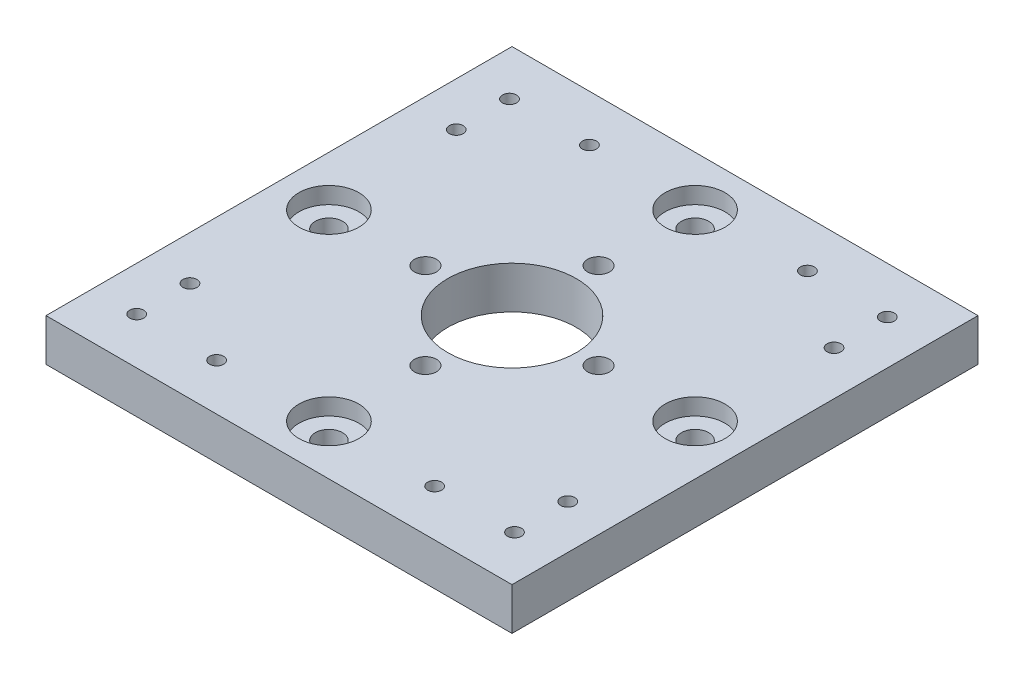
ISO-10303-21;
HEADER;
FILE_DESCRIPTION(('STEP AP214'),'2;1');
FILE_NAME('part.step','',(''),(''),'','','');
FILE_SCHEMA(('AUTOMOTIVE_DESIGN { 1 0 10303 214 1 1 1 1 }'));
ENDSEC;
DATA;
#1=APPLICATION_CONTEXT('core data for automotive mechanical design processes');
#2=APPLICATION_PROTOCOL_DEFINITION('international standard','automotive_design',2000,#1);
#3=PRODUCT_CONTEXT('',#1,'mechanical');
#4=PRODUCT('Part','Part','',(#3));
#5=PRODUCT_RELATED_PRODUCT_CATEGORY('part','',(#4));
#6=PRODUCT_DEFINITION_FORMATION('','',#4);
#7=PRODUCT_DEFINITION_CONTEXT('part definition',#1,'design');
#8=PRODUCT_DEFINITION('design','',#6,#7);
#9=PRODUCT_DEFINITION_SHAPE('','',#8);
#10=(LENGTH_UNIT() NAMED_UNIT(*) SI_UNIT(.MILLI.,.METRE.));
#11=(NAMED_UNIT(*) PLANE_ANGLE_UNIT() SI_UNIT($,.RADIAN.));
#12=(NAMED_UNIT(*) SI_UNIT($,.STERADIAN.) SOLID_ANGLE_UNIT());
#13=UNCERTAINTY_MEASURE_WITH_UNIT(LENGTH_MEASURE(1.E-05),#10,'distance_accuracy_value','');
#14=(GEOMETRIC_REPRESENTATION_CONTEXT(3) GLOBAL_UNCERTAINTY_ASSIGNED_CONTEXT((#13)) GLOBAL_UNIT_ASSIGNED_CONTEXT((#10,
#11,#12)) REPRESENTATION_CONTEXT('',''));
#15=CARTESIAN_POINT('',(0.,0.,0.));
#16=DIRECTION('',(0.,0.,1.));
#17=DIRECTION('',(1.,0.,0.));
#18=AXIS2_PLACEMENT_3D('',#15,#16,#17);
#19=CARTESIAN_POINT('',(1.55309068257925E-12,-0.00100000000000013,27.5));
#20=DIRECTION('',(0.,1.,0.));
#21=DIRECTION('',(0.,0.,1.));
#22=AXIS2_PLACEMENT_3D('',#19,#20,#21);
#23=CYLINDRICAL_SURFACE('',#22,2.05);
#24=CARTESIAN_POINT('',(1.55309068257925E-12,0.,27.5));
#25=DIRECTION('',(0.,1.,0.));
#26=DIRECTION('',(0.,0.,1.));
#27=AXIS2_PLACEMENT_3D('',#24,#25,#26);
#28=CIRCLE('',#27,2.05);
#29=CARTESIAN_POINT('',(1.55309068257925E-12,0.,29.55));
#30=VERTEX_POINT('',#29);
#31=EDGE_CURVE('E170',#30,#30,#28,.F.);
#32=ORIENTED_EDGE('',*,*,#31,.T.);
#33=EDGE_LOOP('',(#32));
#34=FACE_BOUND('',#33,.T.);
#35=CARTESIAN_POINT('',(1.55309068257925E-12,3.85,27.5));
#36=DIRECTION('',(0.,1.,0.));
#37=DIRECTION('',(0.,0.,1.));
#38=AXIS2_PLACEMENT_3D('',#35,#36,#37);
#39=CIRCLE('',#38,2.05);
#40=CARTESIAN_POINT('',(1.55309068257925E-12,3.85,29.55));
#41=VERTEX_POINT('',#40);
#42=EDGE_CURVE('E53',#41,#41,#39,.F.);
#43=ORIENTED_EDGE('',*,*,#42,.F.);
#44=EDGE_LOOP('',(#43));
#45=FACE_BOUND('',#44,.T.);
#46=ADVANCED_FACE('F49',(#34,#45),#23,.F.);
#47=CARTESIAN_POINT('',(27.5000000000008,-0.00100000000000013,-7.76545341289627E-13));
#48=DIRECTION('',(0.,1.,0.));
#49=DIRECTION('',(0.,0.,1.));
#50=AXIS2_PLACEMENT_3D('',#47,#48,#49);
#51=CYLINDRICAL_SURFACE('',#50,2.05);
#52=CARTESIAN_POINT('',(27.5000000000008,0.,-7.76545341289627E-13));
#53=DIRECTION('',(0.,1.,0.));
#54=DIRECTION('',(0.,0.,1.));
#55=AXIS2_PLACEMENT_3D('',#52,#53,#54);
#56=CIRCLE('',#55,2.05);
#57=CARTESIAN_POINT('',(27.5000000000008,0.,2.04999999999922));
#58=VERTEX_POINT('',#57);
#59=EDGE_CURVE('E175',#58,#58,#56,.F.);
#60=ORIENTED_EDGE('',*,*,#59,.T.);
#61=EDGE_LOOP('',(#60));
#62=FACE_BOUND('',#61,.T.);
#63=CARTESIAN_POINT('',(27.5000000000008,3.85,-7.76545341289627E-13));
#64=DIRECTION('',(0.,1.,0.));
#65=DIRECTION('',(0.,0.,1.));
#66=AXIS2_PLACEMENT_3D('',#63,#64,#65);
#67=CIRCLE('',#66,2.05);
#68=CARTESIAN_POINT('',(27.5000000000008,3.85,2.04999999999922));
#69=VERTEX_POINT('',#68);
#70=EDGE_CURVE('E163',#69,#69,#67,.F.);
#71=ORIENTED_EDGE('',*,*,#70,.F.);
#72=EDGE_LOOP('',(#71));
#73=FACE_BOUND('',#72,.T.);
#74=ADVANCED_FACE('F421',(#62,#73),#51,.F.);
#75=CARTESIAN_POINT('',(0.,-0.00100000000000013,-27.5));
#76=DIRECTION('',(0.,1.,0.));
#77=DIRECTION('',(0.,0.,1.));
#78=AXIS2_PLACEMENT_3D('',#75,#76,#77);
#79=CYLINDRICAL_SURFACE('',#78,2.05);
#80=CARTESIAN_POINT('',(0.,0.,-27.5));
#81=DIRECTION('',(0.,1.,0.));
#82=DIRECTION('',(0.,0.,1.));
#83=AXIS2_PLACEMENT_3D('',#80,#81,#82);
#84=CIRCLE('',#83,2.05);
#85=CARTESIAN_POINT('',(0.,0.,-25.45));
#86=VERTEX_POINT('',#85);
#87=EDGE_CURVE('E181',#86,#86,#84,.F.);
#88=ORIENTED_EDGE('',*,*,#87,.T.);
#89=EDGE_LOOP('',(#88));
#90=FACE_BOUND('',#89,.T.);
#91=CARTESIAN_POINT('',(0.,3.85,-27.5));
#92=DIRECTION('',(0.,1.,0.));
#93=DIRECTION('',(0.,0.,1.));
#94=AXIS2_PLACEMENT_3D('',#91,#92,#93);
#95=CIRCLE('',#94,2.05);
#96=CARTESIAN_POINT('',(0.,3.85,-25.45));
#97=VERTEX_POINT('',#96);
#98=EDGE_CURVE('E159',#97,#97,#95,.F.);
#99=ORIENTED_EDGE('',*,*,#98,.F.);
#100=EDGE_LOOP('',(#99));
#101=FACE_BOUND('',#100,.T.);
#102=ADVANCED_FACE('F426',(#90,#101),#79,.F.);
#103=CARTESIAN_POINT('',(-27.4999999999992,-0.00100000000000013,7.79913119987283E-13));
#104=DIRECTION('',(0.,1.,0.));
#105=DIRECTION('',(0.,0.,1.));
#106=AXIS2_PLACEMENT_3D('',#103,#104,#105);
#107=CYLINDRICAL_SURFACE('',#106,2.05);
#108=CARTESIAN_POINT('',(-27.4999999999992,0.,7.79913119987283E-13));
#109=DIRECTION('',(0.,1.,0.));
#110=DIRECTION('',(0.,0.,1.));
#111=AXIS2_PLACEMENT_3D('',#108,#109,#110);
#112=CIRCLE('',#111,2.05);
#113=CARTESIAN_POINT('',(-27.4999999999992,0.,2.05000000000078));
#114=VERTEX_POINT('',#113);
#115=EDGE_CURVE('E190',#114,#114,#112,.F.);
#116=ORIENTED_EDGE('',*,*,#115,.T.);
#117=EDGE_LOOP('',(#116));
#118=FACE_BOUND('',#117,.T.);
#119=CARTESIAN_POINT('',(-27.4999999999992,3.85,7.79913119987283E-13));
#120=DIRECTION('',(0.,1.,0.));
#121=DIRECTION('',(0.,0.,1.));
#122=AXIS2_PLACEMENT_3D('',#119,#120,#121);
#123=CIRCLE('',#122,2.05);
#124=CARTESIAN_POINT('',(-27.4999999999992,3.85,2.05000000000078));
#125=VERTEX_POINT('',#124);
#126=EDGE_CURVE('E155',#125,#125,#123,.F.);
#127=ORIENTED_EDGE('',*,*,#126,.F.);
#128=EDGE_LOOP('',(#127));
#129=FACE_BOUND('',#128,.T.);
#130=ADVANCED_FACE('F505',(#118,#129),#107,.F.);
#131=CARTESIAN_POINT('',(0.,6.35,35.));
#132=DIRECTION('',(0.,0.,-1.));
#133=DIRECTION('',(-1.,0.,0.));
#134=AXIS2_PLACEMENT_3D('',#131,#132,#133);
#135=PLANE('',#134);
#136=DIRECTION('',(1.,0.,0.));
#137=VECTOR('',#136,1.);
#138=CARTESIAN_POINT('',(0.,0.,35.));
#139=LINE('',#138,#137);
#140=CARTESIAN_POINT('',(-35.,0.,35.));
#141=VERTEX_POINT('',#140);
#142=CARTESIAN_POINT('',(35.,0.,35.));
#143=VERTEX_POINT('',#142);
#144=EDGE_CURVE('E138',#141,#143,#139,.T.);
#145=ORIENTED_EDGE('',*,*,#144,.T.);
#146=DIRECTION('',(0.,-1.,0.));
#147=VECTOR('',#146,1.);
#148=CARTESIAN_POINT('',(35.,6.35,35.));
#149=LINE('',#148,#147);
#150=CARTESIAN_POINT('',(35.,6.35,35.));
#151=VERTEX_POINT('',#150);
#152=EDGE_CURVE('E11',#151,#143,#149,.T.);
#153=ORIENTED_EDGE('',*,*,#152,.F.);
#154=DIRECTION('',(1.,0.,0.));
#155=VECTOR('',#154,1.);
#156=CARTESIAN_POINT('',(0.,6.35,35.));
#157=LINE('',#156,#155);
#158=CARTESIAN_POINT('',(-35.,6.35,35.));
#159=VERTEX_POINT('',#158);
#160=EDGE_CURVE('E102',#159,#151,#157,.T.);
#161=ORIENTED_EDGE('',*,*,#160,.F.);
#162=DIRECTION('',(0.,-1.,0.));
#163=VECTOR('',#162,1.);
#164=CARTESIAN_POINT('',(-35.,6.35,35.));
#165=LINE('',#164,#163);
#166=EDGE_CURVE('E69',#159,#141,#165,.T.);
#167=ORIENTED_EDGE('',*,*,#166,.T.);
#168=EDGE_LOOP('',(#145,#153,#161,#167));
#169=FACE_BOUND('',#168,.T.);
#170=ADVANCED_FACE('F502',(#169),#135,.F.);
#171=CARTESIAN_POINT('',(35.,6.35,0.));
#172=DIRECTION('',(-1.,0.,0.));
#173=DIRECTION('',(0.,0.,1.));
#174=AXIS2_PLACEMENT_3D('',#171,#172,#173);
#175=PLANE('',#174);
#176=DIRECTION('',(0.,0.,-1.));
#177=VECTOR('',#176,1.);
#178=CARTESIAN_POINT('',(35.,0.,0.));
#179=LINE('',#178,#177);
#180=CARTESIAN_POINT('',(35.,0.,-35.));
#181=VERTEX_POINT('',#180);
#182=EDGE_CURVE('E108',#143,#181,#179,.T.);
#183=ORIENTED_EDGE('',*,*,#182,.T.);
#184=DIRECTION('',(0.,-1.,0.));
#185=VECTOR('',#184,1.);
#186=CARTESIAN_POINT('',(35.,6.35,-35.));
#187=LINE('',#186,#185);
#188=CARTESIAN_POINT('',(35.,6.35,-35.));
#189=VERTEX_POINT('',#188);
#190=EDGE_CURVE('E60',#189,#181,#187,.T.);
#191=ORIENTED_EDGE('',*,*,#190,.F.);
#192=DIRECTION('',(0.,0.,-1.));
#193=VECTOR('',#192,1.);
#194=CARTESIAN_POINT('',(35.,6.35,0.));
#195=LINE('',#194,#193);
#196=EDGE_CURVE('E94',#151,#189,#195,.T.);
#197=ORIENTED_EDGE('',*,*,#196,.F.);
#198=ORIENTED_EDGE('',*,*,#152,.T.);
#199=EDGE_LOOP('',(#183,#191,#197,#198));
#200=FACE_BOUND('',#199,.T.);
#201=ADVANCED_FACE('F107',(#200),#175,.F.);
#202=CARTESIAN_POINT('',(0.,6.35,-35.));
#203=DIRECTION('',(0.,0.,-1.));
#204=DIRECTION('',(-1.,0.,0.));
#205=AXIS2_PLACEMENT_3D('',#202,#203,#204);
#206=PLANE('',#205);
#207=DIRECTION('',(1.,0.,0.));
#208=VECTOR('',#207,1.);
#209=CARTESIAN_POINT('',(0.,0.,-35.));
#210=LINE('',#209,#208);
#211=CARTESIAN_POINT('',(-35.,0.,-35.));
#212=VERTEX_POINT('',#211);
#213=EDGE_CURVE('E143',#212,#181,#210,.T.);
#214=ORIENTED_EDGE('',*,*,#213,.F.);
#215=DIRECTION('',(0.,-1.,0.));
#216=VECTOR('',#215,1.);
#217=CARTESIAN_POINT('',(-35.,6.35,-35.));
#218=LINE('',#217,#216);
#219=CARTESIAN_POINT('',(-35.,6.35,-35.));
#220=VERTEX_POINT('',#219);
#221=EDGE_CURVE('E83',#220,#212,#218,.T.);
#222=ORIENTED_EDGE('',*,*,#221,.F.);
#223=DIRECTION('',(1.,0.,0.));
#224=VECTOR('',#223,1.);
#225=CARTESIAN_POINT('',(0.,6.35,-35.));
#226=LINE('',#225,#224);
#227=EDGE_CURVE('E101',#220,#189,#226,.T.);
#228=ORIENTED_EDGE('',*,*,#227,.T.);
#229=ORIENTED_EDGE('',*,*,#190,.T.);
#230=EDGE_LOOP('',(#214,#222,#228,#229));
#231=FACE_BOUND('',#230,.T.);
#232=ADVANCED_FACE('F113',(#231),#206,.T.);
#233=CARTESIAN_POINT('',(0.,6.35,13.));
#234=DIRECTION('',(0.,-1.,0.));
#235=DIRECTION('',(0.,0.,-1.));
#236=AXIS2_PLACEMENT_3D('',#233,#234,#235);
#237=CYLINDRICAL_SURFACE('',#236,1.65);
#238=CARTESIAN_POINT('',(0.,6.35,13.));
#239=DIRECTION('',(0.,1.,0.));
#240=DIRECTION('',(0.,0.,1.));
#241=AXIS2_PLACEMENT_3D('',#238,#239,#240);
#242=CIRCLE('',#241,1.65);
#243=CARTESIAN_POINT('',(0.,6.35,14.65));
#244=VERTEX_POINT('',#243);
#245=EDGE_CURVE('E300',#244,#244,#242,.T.);
#246=ORIENTED_EDGE('',*,*,#245,.T.);
#247=EDGE_LOOP('',(#246));
#248=FACE_BOUND('',#247,.T.);
#249=CARTESIAN_POINT('',(0.,0.,13.));
#250=DIRECTION('',(0.,1.,0.));
#251=DIRECTION('',(0.,0.,1.));
#252=AXIS2_PLACEMENT_3D('',#249,#250,#251);
#253=CIRCLE('',#252,1.65);
#254=CARTESIAN_POINT('',(0.,0.,14.65));
#255=VERTEX_POINT('',#254);
#256=EDGE_CURVE('E134',#255,#255,#253,.T.);
#257=ORIENTED_EDGE('',*,*,#256,.F.);
#258=EDGE_LOOP('',(#257));
#259=FACE_BOUND('',#258,.T.);
#260=ADVANCED_FACE('F399',(#248,#259),#237,.F.);
#261=CARTESIAN_POINT('',(13.,6.35,0.));
#262=DIRECTION('',(0.,-1.,0.));
#263=DIRECTION('',(0.,0.,-1.));
#264=AXIS2_PLACEMENT_3D('',#261,#262,#263);
#265=CYLINDRICAL_SURFACE('',#264,1.65);
#266=CARTESIAN_POINT('',(13.,6.35,0.));
#267=DIRECTION('',(0.,1.,0.));
#268=DIRECTION('',(0.,0.,1.));
#269=AXIS2_PLACEMENT_3D('',#266,#267,#268);
#270=CIRCLE('',#269,1.65);
#271=CARTESIAN_POINT('',(13.,6.35,1.65));
#272=VERTEX_POINT('',#271);
#273=EDGE_CURVE('E296',#272,#272,#270,.T.);
#274=ORIENTED_EDGE('',*,*,#273,.T.);
#275=EDGE_LOOP('',(#274));
#276=FACE_BOUND('',#275,.T.);
#277=CARTESIAN_POINT('',(13.,0.,0.));
#278=DIRECTION('',(0.,1.,0.));
#279=DIRECTION('',(0.,0.,1.));
#280=AXIS2_PLACEMENT_3D('',#277,#278,#279);
#281=CIRCLE('',#280,1.65);
#282=CARTESIAN_POINT('',(13.,0.,1.65));
#283=VERTEX_POINT('',#282);
#284=EDGE_CURVE('E130',#283,#283,#281,.T.);
#285=ORIENTED_EDGE('',*,*,#284,.F.);
#286=EDGE_LOOP('',(#285));
#287=FACE_BOUND('',#286,.T.);
#288=ADVANCED_FACE('F402',(#276,#287),#265,.F.);
#289=CARTESIAN_POINT('',(0.,6.35,-13.));
#290=DIRECTION('',(0.,-1.,0.));
#291=DIRECTION('',(0.,0.,-1.));
#292=AXIS2_PLACEMENT_3D('',#289,#290,#291);
#293=CYLINDRICAL_SURFACE('',#292,1.65);
#294=CARTESIAN_POINT('',(0.,6.35,-13.));
#295=DIRECTION('',(0.,1.,0.));
#296=DIRECTION('',(0.,0.,1.));
#297=AXIS2_PLACEMENT_3D('',#294,#295,#296);
#298=CIRCLE('',#297,1.65);
#299=CARTESIAN_POINT('',(0.,6.35,-11.35));
#300=VERTEX_POINT('',#299);
#301=EDGE_CURVE('E292',#300,#300,#298,.T.);
#302=ORIENTED_EDGE('',*,*,#301,.T.);
#303=EDGE_LOOP('',(#302));
#304=FACE_BOUND('',#303,.T.);
#305=CARTESIAN_POINT('',(0.,0.,-13.));
#306=DIRECTION('',(0.,1.,0.));
#307=DIRECTION('',(0.,0.,1.));
#308=AXIS2_PLACEMENT_3D('',#305,#306,#307);
#309=CIRCLE('',#308,1.65);
#310=CARTESIAN_POINT('',(0.,0.,-11.35));
#311=VERTEX_POINT('',#310);
#312=EDGE_CURVE('E125',#311,#311,#309,.T.);
#313=ORIENTED_EDGE('',*,*,#312,.F.);
#314=EDGE_LOOP('',(#313));
#315=FACE_BOUND('',#314,.T.);
#316=ADVANCED_FACE('F417',(#304,#315),#293,.F.);
#317=CARTESIAN_POINT('',(-13.,6.35,0.));
#318=DIRECTION('',(0.,-1.,0.));
#319=DIRECTION('',(0.,0.,-1.));
#320=AXIS2_PLACEMENT_3D('',#317,#318,#319);
#321=CYLINDRICAL_SURFACE('',#320,1.65);
#322=CARTESIAN_POINT('',(-13.,6.35,0.));
#323=DIRECTION('',(0.,1.,0.));
#324=DIRECTION('',(0.,0.,1.));
#325=AXIS2_PLACEMENT_3D('',#322,#323,#324);
#326=CIRCLE('',#325,1.65);
#327=CARTESIAN_POINT('',(-13.,6.35,1.65));
#328=VERTEX_POINT('',#327);
#329=EDGE_CURVE('E150',#328,#328,#326,.T.);
#330=ORIENTED_EDGE('',*,*,#329,.T.);
#331=EDGE_LOOP('',(#330));
#332=FACE_BOUND('',#331,.T.);
#333=CARTESIAN_POINT('',(-13.,0.,0.));
#334=DIRECTION('',(0.,1.,0.));
#335=DIRECTION('',(0.,0.,1.));
#336=AXIS2_PLACEMENT_3D('',#333,#334,#335);
#337=CIRCLE('',#336,1.65);
#338=CARTESIAN_POINT('',(-13.,0.,1.65));
#339=VERTEX_POINT('',#338);
#340=EDGE_CURVE('E121',#339,#339,#337,.T.);
#341=ORIENTED_EDGE('',*,*,#340,.F.);
#342=EDGE_LOOP('',(#341));
#343=FACE_BOUND('',#342,.T.);
#344=ADVANCED_FACE('F51',(#332,#343),#321,.F.);
#345=CARTESIAN_POINT('',(-35.,6.35,0.));
#346=DIRECTION('',(-1.,0.,0.));
#347=DIRECTION('',(0.,0.,1.));
#348=AXIS2_PLACEMENT_3D('',#345,#346,#347);
#349=PLANE('',#348);
#350=DIRECTION('',(0.,0.,-1.));
#351=VECTOR('',#350,1.);
#352=CARTESIAN_POINT('',(-35.,0.,0.));
#353=LINE('',#352,#351);
#354=EDGE_CURVE('E146',#141,#212,#353,.T.);
#355=ORIENTED_EDGE('',*,*,#354,.F.);
#356=ORIENTED_EDGE('',*,*,#166,.F.);
#357=DIRECTION('',(0.,0.,-1.));
#358=VECTOR('',#357,1.);
#359=CARTESIAN_POINT('',(-35.,6.35,0.));
#360=LINE('',#359,#358);
#361=EDGE_CURVE('E115',#159,#220,#360,.T.);
#362=ORIENTED_EDGE('',*,*,#361,.T.);
#363=ORIENTED_EDGE('',*,*,#221,.T.);
#364=EDGE_LOOP('',(#355,#356,#362,#363));
#365=FACE_BOUND('',#364,.T.);
#366=ADVANCED_FACE('F357',(#365),#349,.T.);
#367=CARTESIAN_POINT('',(0.,6.35,0.));
#368=DIRECTION('',(0.,1.,0.));
#369=DIRECTION('',(0.,0.,1.));
#370=AXIS2_PLACEMENT_3D('',#367,#368,#369);
#371=PLANE('',#370);
#372=CARTESIAN_POINT('',(0.,6.35,-27.5));
#373=DIRECTION('',(0.,1.,0.));
#374=DIRECTION('',(0.,0.,1.));
#375=AXIS2_PLACEMENT_3D('',#372,#373,#374);
#376=CIRCLE('',#375,4.5);
#377=CARTESIAN_POINT('',(0.,6.35,-23.));
#378=VERTEX_POINT('',#377);
#379=EDGE_CURVE('E336',#378,#378,#376,.T.);
#380=ORIENTED_EDGE('',*,*,#379,.F.);
#381=EDGE_LOOP('',(#380));
#382=FACE_BOUND('',#381,.T.);
#383=CARTESIAN_POINT('',(27.5000000000008,6.35,-7.76545341289627E-13));
#384=DIRECTION('',(0.,1.,0.));
#385=DIRECTION('',(0.,0.,1.));
#386=AXIS2_PLACEMENT_3D('',#383,#384,#385);
#387=CIRCLE('',#386,4.5);
#388=CARTESIAN_POINT('',(27.5000000000008,6.35,4.49999999999923));
#389=VERTEX_POINT('',#388);
#390=EDGE_CURVE('E332',#389,#389,#387,.T.);
#391=ORIENTED_EDGE('',*,*,#390,.F.);
#392=EDGE_LOOP('',(#391));
#393=FACE_BOUND('',#392,.T.);
#394=CARTESIAN_POINT('',(1.55309068257925E-12,6.35,27.5));
#395=DIRECTION('',(0.,1.,0.));
#396=DIRECTION('',(0.,0.,1.));
#397=AXIS2_PLACEMENT_3D('',#394,#395,#396);
#398=CIRCLE('',#397,4.5);
#399=CARTESIAN_POINT('',(1.55309068257925E-12,6.35,32.));
#400=VERTEX_POINT('',#399);
#401=EDGE_CURVE('E324',#400,#400,#398,.T.);
#402=ORIENTED_EDGE('',*,*,#401,.F.);
#403=EDGE_LOOP('',(#402));
#404=FACE_BOUND('',#403,.T.);
#405=CARTESIAN_POINT('',(-27.4999999999992,6.35,7.79913119987283E-13));
#406=DIRECTION('',(0.,1.,0.));
#407=DIRECTION('',(0.,0.,1.));
#408=AXIS2_PLACEMENT_3D('',#405,#406,#407);
#409=CIRCLE('',#408,4.5);
#410=CARTESIAN_POINT('',(-27.4999999999992,6.35,4.50000000000078));
#411=VERTEX_POINT('',#410);
#412=EDGE_CURVE('E316',#411,#411,#409,.T.);
#413=ORIENTED_EDGE('',*,*,#412,.F.);
#414=EDGE_LOOP('',(#413));
#415=FACE_BOUND('',#414,.T.);
#416=CARTESIAN_POINT('',(0.,6.35,0.));
#417=DIRECTION('',(0.,1.,0.));
#418=DIRECTION('',(0.,0.,1.));
#419=AXIS2_PLACEMENT_3D('',#416,#417,#418);
#420=CIRCLE('',#419,9.65);
#421=CARTESIAN_POINT('',(0.,6.35,9.65));
#422=VERTEX_POINT('',#421);
#423=EDGE_CURVE('E185',#422,#422,#420,.T.);
#424=ORIENTED_EDGE('',*,*,#423,.F.);
#425=EDGE_LOOP('',(#424));
#426=FACE_BOUND('',#425,.T.);
#427=CARTESIAN_POINT('',(16.375,6.35,28.));
#428=DIRECTION('',(0.,1.,0.));
#429=DIRECTION('',(0.,0.,-1.));
#430=AXIS2_PLACEMENT_3D('',#427,#428,#429);
#431=CIRCLE('',#430,1.05);
#432=CARTESIAN_POINT('',(16.375,6.35,26.95));
#433=VERTEX_POINT('',#432);
#434=EDGE_CURVE('E241',#433,#433,#431,.T.);
#435=ORIENTED_EDGE('',*,*,#434,.F.);
#436=EDGE_LOOP('',(#435));
#437=FACE_BOUND('',#436,.T.);
#438=CARTESIAN_POINT('',(28.375,6.35,28.));
#439=DIRECTION('',(0.,1.,0.));
#440=DIRECTION('',(0.,0.,-1.));
#441=AXIS2_PLACEMENT_3D('',#438,#439,#440);
#442=CIRCLE('',#441,1.05);
#443=CARTESIAN_POINT('',(28.375,6.35,26.95));
#444=VERTEX_POINT('',#443);
#445=EDGE_CURVE('E233',#444,#444,#442,.T.);
#446=ORIENTED_EDGE('',*,*,#445,.F.);
#447=EDGE_LOOP('',(#446));
#448=FACE_BOUND('',#447,.T.);
#449=CARTESIAN_POINT('',(28.375,6.35,20.));
#450=DIRECTION('',(0.,1.,0.));
#451=DIRECTION('',(0.,0.,-1.));
#452=AXIS2_PLACEMENT_3D('',#449,#450,#451);
#453=CIRCLE('',#452,1.05);
#454=CARTESIAN_POINT('',(28.375,6.35,18.95));
#455=VERTEX_POINT('',#454);
#456=EDGE_CURVE('E224',#455,#455,#453,.T.);
#457=ORIENTED_EDGE('',*,*,#456,.F.);
#458=EDGE_LOOP('',(#457));
#459=FACE_BOUND('',#458,.T.);
#460=CARTESIAN_POINT('',(-16.375,6.35,-28.));
#461=DIRECTION('',(0.,1.,0.));
#462=DIRECTION('',(0.,0.,-1.));
#463=AXIS2_PLACEMENT_3D('',#460,#461,#462);
#464=CIRCLE('',#463,1.05);
#465=CARTESIAN_POINT('',(-16.375,6.35,-29.05));
#466=VERTEX_POINT('',#465);
#467=EDGE_CURVE('E223',#466,#466,#464,.T.);
#468=ORIENTED_EDGE('',*,*,#467,.F.);
#469=EDGE_LOOP('',(#468));
#470=FACE_BOUND('',#469,.T.);
#471=CARTESIAN_POINT('',(-28.375,6.35,-28.));
#472=DIRECTION('',(0.,1.,0.));
#473=DIRECTION('',(0.,0.,-1.));
#474=AXIS2_PLACEMENT_3D('',#471,#472,#473);
#475=CIRCLE('',#474,1.05);
#476=CARTESIAN_POINT('',(-28.375,6.35,-29.05));
#477=VERTEX_POINT('',#476);
#478=EDGE_CURVE('E273',#477,#477,#475,.T.);
#479=ORIENTED_EDGE('',*,*,#478,.F.);
#480=EDGE_LOOP('',(#479));
#481=FACE_BOUND('',#480,.T.);
#482=CARTESIAN_POINT('',(-28.375,6.35,-20.));
#483=DIRECTION('',(0.,1.,0.));
#484=DIRECTION('',(0.,0.,-1.));
#485=AXIS2_PLACEMENT_3D('',#482,#483,#484);
#486=CIRCLE('',#485,1.05);
#487=CARTESIAN_POINT('',(-28.375,6.35,-21.05));
#488=VERTEX_POINT('',#487);
#489=EDGE_CURVE('E265',#488,#488,#486,.T.);
#490=ORIENTED_EDGE('',*,*,#489,.F.);
#491=EDGE_LOOP('',(#490));
#492=FACE_BOUND('',#491,.T.);
#493=CARTESIAN_POINT('',(28.375,6.35,-20.));
#494=DIRECTION('',(0.,1.,0.));
#495=DIRECTION('',(0.,0.,1.));
#496=AXIS2_PLACEMENT_3D('',#493,#494,#495);
#497=CIRCLE('',#496,1.05);
#498=CARTESIAN_POINT('',(28.375,6.35,-18.95));
#499=VERTEX_POINT('',#498);
#500=EDGE_CURVE('E256',#499,#499,#497,.T.);
#501=ORIENTED_EDGE('',*,*,#500,.F.);
#502=EDGE_LOOP('',(#501));
#503=FACE_BOUND('',#502,.T.);
#504=CARTESIAN_POINT('',(28.375,6.35,-28.));
#505=DIRECTION('',(0.,1.,0.));
#506=DIRECTION('',(0.,0.,1.));
#507=AXIS2_PLACEMENT_3D('',#504,#505,#506);
#508=CIRCLE('',#507,1.05);
#509=CARTESIAN_POINT('',(28.375,6.35,-26.95));
#510=VERTEX_POINT('',#509);
#511=EDGE_CURVE('E255',#510,#510,#508,.T.);
#512=ORIENTED_EDGE('',*,*,#511,.F.);
#513=EDGE_LOOP('',(#512));
#514=FACE_BOUND('',#513,.T.);
#515=CARTESIAN_POINT('',(-28.375,6.35,28.));
#516=DIRECTION('',(0.,1.,0.));
#517=DIRECTION('',(0.,0.,1.));
#518=AXIS2_PLACEMENT_3D('',#515,#516,#517);
#519=CIRCLE('',#518,1.05);
#520=CARTESIAN_POINT('',(-28.375,6.35,29.05));
#521=VERTEX_POINT('',#520);
#522=EDGE_CURVE('E198',#521,#521,#519,.T.);
#523=ORIENTED_EDGE('',*,*,#522,.F.);
#524=EDGE_LOOP('',(#523));
#525=FACE_BOUND('',#524,.T.);
#526=CARTESIAN_POINT('',(-28.375,6.35,20.));
#527=DIRECTION('',(0.,1.,0.));
#528=DIRECTION('',(0.,0.,1.));
#529=AXIS2_PLACEMENT_3D('',#526,#527,#528);
#530=CIRCLE('',#529,1.05);
#531=CARTESIAN_POINT('',(-28.375,6.35,21.05));
#532=VERTEX_POINT('',#531);
#533=EDGE_CURVE('E208',#532,#532,#530,.T.);
#534=ORIENTED_EDGE('',*,*,#533,.F.);
#535=EDGE_LOOP('',(#534));
#536=FACE_BOUND('',#535,.T.);
#537=CARTESIAN_POINT('',(-16.375,6.35,28.));
#538=DIRECTION('',(0.,1.,0.));
#539=DIRECTION('',(0.,0.,1.));
#540=AXIS2_PLACEMENT_3D('',#537,#538,#539);
#541=CIRCLE('',#540,1.05);
#542=CARTESIAN_POINT('',(-16.375,6.35,29.05));
#543=VERTEX_POINT('',#542);
#544=EDGE_CURVE('E207',#543,#543,#541,.T.);
#545=ORIENTED_EDGE('',*,*,#544,.F.);
#546=EDGE_LOOP('',(#545));
#547=FACE_BOUND('',#546,.T.);
#548=CARTESIAN_POINT('',(16.375,6.35,-28.));
#549=DIRECTION('',(0.,1.,0.));
#550=DIRECTION('',(0.,0.,1.));
#551=AXIS2_PLACEMENT_3D('',#548,#549,#550);
#552=CIRCLE('',#551,1.05);
#553=CARTESIAN_POINT('',(16.375,6.35,-26.95));
#554=VERTEX_POINT('',#553);
#555=EDGE_CURVE('E260',#554,#554,#552,.T.);
#556=ORIENTED_EDGE('',*,*,#555,.F.);
#557=EDGE_LOOP('',(#556));
#558=FACE_BOUND('',#557,.T.);
#559=ORIENTED_EDGE('',*,*,#329,.F.);
#560=EDGE_LOOP('',(#559));
#561=FACE_BOUND('',#560,.T.);
#562=ORIENTED_EDGE('',*,*,#301,.F.);
#563=EDGE_LOOP('',(#562));
#564=FACE_BOUND('',#563,.T.);
#565=ORIENTED_EDGE('',*,*,#273,.F.);
#566=EDGE_LOOP('',(#565));
#567=FACE_BOUND('',#566,.T.);
#568=ORIENTED_EDGE('',*,*,#245,.F.);
#569=EDGE_LOOP('',(#568));
#570=FACE_BOUND('',#569,.T.);
#571=ORIENTED_EDGE('',*,*,#160,.T.);
#572=ORIENTED_EDGE('',*,*,#196,.T.);
#573=ORIENTED_EDGE('',*,*,#227,.F.);
#574=ORIENTED_EDGE('',*,*,#361,.F.);
#575=EDGE_LOOP('',(#571,#572,#573,#574));
#576=FACE_BOUND('',#575,.T.);
#577=ADVANCED_FACE('F98',(#382,#393,#404,#415,#426,#437,#448,#459,#470,#481,#492,#503,#514,#525,
#536,#547,#558,#561,#564,#567,#570,#576),#371,.T.);
#578=CARTESIAN_POINT('',(0.,0.,0.));
#579=DIRECTION('',(0.,1.,0.));
#580=DIRECTION('',(0.,0.,1.));
#581=AXIS2_PLACEMENT_3D('',#578,#579,#580);
#582=PLANE('',#581);
#583=ORIENTED_EDGE('',*,*,#115,.F.);
#584=EDGE_LOOP('',(#583));
#585=FACE_BOUND('',#584,.T.);
#586=ORIENTED_EDGE('',*,*,#87,.F.);
#587=EDGE_LOOP('',(#586));
#588=FACE_BOUND('',#587,.T.);
#589=ORIENTED_EDGE('',*,*,#59,.F.);
#590=EDGE_LOOP('',(#589));
#591=FACE_BOUND('',#590,.T.);
#592=ORIENTED_EDGE('',*,*,#31,.F.);
#593=EDGE_LOOP('',(#592));
#594=FACE_BOUND('',#593,.T.);
#595=CARTESIAN_POINT('',(0.,0.,0.));
#596=DIRECTION('',(0.,1.,0.));
#597=DIRECTION('',(0.,0.,1.));
#598=AXIS2_PLACEMENT_3D('',#595,#596,#597);
#599=CIRCLE('',#598,9.65);
#600=CARTESIAN_POINT('',(0.,0.,9.65));
#601=VERTEX_POINT('',#600);
#602=EDGE_CURVE('E189',#601,#601,#599,.F.);
#603=ORIENTED_EDGE('',*,*,#602,.F.);
#604=EDGE_LOOP('',(#603));
#605=FACE_BOUND('',#604,.T.);
#606=CARTESIAN_POINT('',(16.375,0.,28.));
#607=DIRECTION('',(0.,1.,0.));
#608=DIRECTION('',(0.,0.,1.));
#609=AXIS2_PLACEMENT_3D('',#606,#607,#608);
#610=CIRCLE('',#609,1.05);
#611=CARTESIAN_POINT('',(16.375,0.,29.05));
#612=VERTEX_POINT('',#611);
#613=EDGE_CURVE('E212',#612,#612,#610,.F.);
#614=ORIENTED_EDGE('',*,*,#613,.F.);
#615=EDGE_LOOP('',(#614));
#616=FACE_BOUND('',#615,.T.);
#617=CARTESIAN_POINT('',(28.375,0.,28.));
#618=DIRECTION('',(0.,1.,0.));
#619=DIRECTION('',(0.,0.,1.));
#620=AXIS2_PLACEMENT_3D('',#617,#618,#619);
#621=CIRCLE('',#620,1.05);
#622=CARTESIAN_POINT('',(28.375,0.,29.05));
#623=VERTEX_POINT('',#622);
#624=EDGE_CURVE('E237',#623,#623,#621,.F.);
#625=ORIENTED_EDGE('',*,*,#624,.F.);
#626=EDGE_LOOP('',(#625));
#627=FACE_BOUND('',#626,.T.);
#628=CARTESIAN_POINT('',(28.375,0.,20.));
#629=DIRECTION('',(0.,1.,0.));
#630=DIRECTION('',(0.,0.,1.));
#631=AXIS2_PLACEMENT_3D('',#628,#629,#630);
#632=CIRCLE('',#631,1.05);
#633=CARTESIAN_POINT('',(28.375,0.,21.05));
#634=VERTEX_POINT('',#633);
#635=EDGE_CURVE('E229',#634,#634,#632,.F.);
#636=ORIENTED_EDGE('',*,*,#635,.F.);
#637=EDGE_LOOP('',(#636));
#638=FACE_BOUND('',#637,.T.);
#639=CARTESIAN_POINT('',(-16.375,0.,-28.));
#640=DIRECTION('',(0.,1.,0.));
#641=DIRECTION('',(0.,0.,1.));
#642=AXIS2_PLACEMENT_3D('',#639,#640,#641);
#643=CIRCLE('',#642,1.05);
#644=CARTESIAN_POINT('',(-16.375,0.,-26.95));
#645=VERTEX_POINT('',#644);
#646=EDGE_CURVE('E219',#645,#645,#643,.F.);
#647=ORIENTED_EDGE('',*,*,#646,.F.);
#648=EDGE_LOOP('',(#647));
#649=FACE_BOUND('',#648,.T.);
#650=CARTESIAN_POINT('',(-28.375,0.,-28.));
#651=DIRECTION('',(0.,1.,0.));
#652=DIRECTION('',(0.,0.,1.));
#653=AXIS2_PLACEMENT_3D('',#650,#651,#652);
#654=CIRCLE('',#653,1.05);
#655=CARTESIAN_POINT('',(-28.375,0.,-26.95));
#656=VERTEX_POINT('',#655);
#657=EDGE_CURVE('E228',#656,#656,#654,.F.);
#658=ORIENTED_EDGE('',*,*,#657,.F.);
#659=EDGE_LOOP('',(#658));
#660=FACE_BOUND('',#659,.T.);
#661=CARTESIAN_POINT('',(-28.375,0.,-20.));
#662=DIRECTION('',(0.,1.,0.));
#663=DIRECTION('',(0.,0.,1.));
#664=AXIS2_PLACEMENT_3D('',#661,#662,#663);
#665=CIRCLE('',#664,1.05);
#666=CARTESIAN_POINT('',(-28.375,0.,-18.95));
#667=VERTEX_POINT('',#666);
#668=EDGE_CURVE('E269',#667,#667,#665,.F.);
#669=ORIENTED_EDGE('',*,*,#668,.F.);
#670=EDGE_LOOP('',(#669));
#671=FACE_BOUND('',#670,.T.);
#672=CARTESIAN_POINT('',(28.375,0.,-20.));
#673=DIRECTION('',(0.,1.,0.));
#674=DIRECTION('',(0.,0.,1.));
#675=AXIS2_PLACEMENT_3D('',#672,#673,#674);
#676=CIRCLE('',#675,1.05);
#677=CARTESIAN_POINT('',(28.375,0.,-18.95));
#678=VERTEX_POINT('',#677);
#679=EDGE_CURVE('E261',#678,#678,#676,.F.);
#680=ORIENTED_EDGE('',*,*,#679,.F.);
#681=EDGE_LOOP('',(#680));
#682=FACE_BOUND('',#681,.T.);
#683=CARTESIAN_POINT('',(28.375,0.,-28.));
#684=DIRECTION('',(0.,1.,0.));
#685=DIRECTION('',(0.,0.,1.));
#686=AXIS2_PLACEMENT_3D('',#683,#684,#685);
#687=CIRCLE('',#686,1.05);
#688=CARTESIAN_POINT('',(28.375,0.,-26.95));
#689=VERTEX_POINT('',#688);
#690=EDGE_CURVE('E251',#689,#689,#687,.F.);
#691=ORIENTED_EDGE('',*,*,#690,.F.);
#692=EDGE_LOOP('',(#691));
#693=FACE_BOUND('',#692,.T.);
#694=CARTESIAN_POINT('',(-28.375,0.,28.));
#695=DIRECTION('',(0.,1.,0.));
#696=DIRECTION('',(0.,0.,1.));
#697=AXIS2_PLACEMENT_3D('',#694,#695,#696);
#698=CIRCLE('',#697,1.05);
#699=CARTESIAN_POINT('',(-28.375,0.,29.05));
#700=VERTEX_POINT('',#699);
#701=EDGE_CURVE('E194',#700,#700,#698,.F.);
#702=ORIENTED_EDGE('',*,*,#701,.F.);
#703=EDGE_LOOP('',(#702));
#704=FACE_BOUND('',#703,.T.);
#705=CARTESIAN_POINT('',(-28.375,0.,20.));
#706=DIRECTION('',(0.,1.,0.));
#707=DIRECTION('',(0.,0.,1.));
#708=AXIS2_PLACEMENT_3D('',#705,#706,#707);
#709=CIRCLE('',#708,1.05);
#710=CARTESIAN_POINT('',(-28.375,0.,21.05));
#711=VERTEX_POINT('',#710);
#712=EDGE_CURVE('E202',#711,#711,#709,.F.);
#713=ORIENTED_EDGE('',*,*,#712,.F.);
#714=EDGE_LOOP('',(#713));
#715=FACE_BOUND('',#714,.T.);
#716=CARTESIAN_POINT('',(-16.375,0.,28.));
#717=DIRECTION('',(0.,1.,0.));
#718=DIRECTION('',(0.,0.,1.));
#719=AXIS2_PLACEMENT_3D('',#716,#717,#718);
#720=CIRCLE('',#719,1.05);
#721=CARTESIAN_POINT('',(-16.375,0.,29.05));
#722=VERTEX_POINT('',#721);
#723=EDGE_CURVE('E203',#722,#722,#720,.F.);
#724=ORIENTED_EDGE('',*,*,#723,.F.);
#725=EDGE_LOOP('',(#724));
#726=FACE_BOUND('',#725,.T.);
#727=CARTESIAN_POINT('',(16.375,0.,-28.));
#728=DIRECTION('',(0.,1.,0.));
#729=DIRECTION('',(0.,0.,1.));
#730=AXIS2_PLACEMENT_3D('',#727,#728,#729);
#731=CIRCLE('',#730,1.05);
#732=CARTESIAN_POINT('',(16.375,0.,-26.95));
#733=VERTEX_POINT('',#732);
#734=EDGE_CURVE('E126',#733,#733,#731,.F.);
#735=ORIENTED_EDGE('',*,*,#734,.F.);
#736=EDGE_LOOP('',(#735));
#737=FACE_BOUND('',#736,.T.);
#738=ORIENTED_EDGE('',*,*,#340,.T.);
#739=EDGE_LOOP('',(#738));
#740=FACE_BOUND('',#739,.T.);
#741=ORIENTED_EDGE('',*,*,#312,.T.);
#742=EDGE_LOOP('',(#741));
#743=FACE_BOUND('',#742,.T.);
#744=ORIENTED_EDGE('',*,*,#284,.T.);
#745=EDGE_LOOP('',(#744));
#746=FACE_BOUND('',#745,.T.);
#747=ORIENTED_EDGE('',*,*,#256,.T.);
#748=EDGE_LOOP('',(#747));
#749=FACE_BOUND('',#748,.T.);
#750=ORIENTED_EDGE('',*,*,#144,.F.);
#751=ORIENTED_EDGE('',*,*,#354,.T.);
#752=ORIENTED_EDGE('',*,*,#213,.T.);
#753=ORIENTED_EDGE('',*,*,#182,.F.);
#754=EDGE_LOOP('',(#750,#751,#752,#753));
#755=FACE_BOUND('',#754,.T.);
#756=ADVANCED_FACE('F356',(#585,#588,#591,#594,#605,#616,#627,#638,#649,#660,#671,#682,#693,
#704,#715,#726,#737,#740,#743,#746,#749,#755),#582,.F.);
#757=CARTESIAN_POINT('',(16.375,-0.00100000000000013,-28.));
#758=DIRECTION('',(0.,1.,0.));
#759=DIRECTION('',(0.,0.,1.));
#760=AXIS2_PLACEMENT_3D('',#757,#758,#759);
#761=CYLINDRICAL_SURFACE('',#760,1.05);
#762=ORIENTED_EDGE('',*,*,#555,.T.);
#763=EDGE_LOOP('',(#762));
#764=FACE_BOUND('',#763,.T.);
#765=ORIENTED_EDGE('',*,*,#734,.T.);
#766=EDGE_LOOP('',(#765));
#767=FACE_BOUND('',#766,.T.);
#768=ADVANCED_FACE('F408',(#764,#767),#761,.F.);
#769=CARTESIAN_POINT('',(-16.375,-0.00100000000000013,28.));
#770=DIRECTION('',(0.,1.,0.));
#771=DIRECTION('',(0.,0.,1.));
#772=AXIS2_PLACEMENT_3D('',#769,#770,#771);
#773=CYLINDRICAL_SURFACE('',#772,1.05);
#774=ORIENTED_EDGE('',*,*,#544,.T.);
#775=EDGE_LOOP('',(#774));
#776=FACE_BOUND('',#775,.T.);
#777=ORIENTED_EDGE('',*,*,#723,.T.);
#778=EDGE_LOOP('',(#777));
#779=FACE_BOUND('',#778,.T.);
#780=ADVANCED_FACE('F444',(#776,#779),#773,.F.);
#781=CARTESIAN_POINT('',(-28.375,-0.00100000000000013,20.));
#782=DIRECTION('',(0.,1.,0.));
#783=DIRECTION('',(0.,0.,1.));
#784=AXIS2_PLACEMENT_3D('',#781,#782,#783);
#785=CYLINDRICAL_SURFACE('',#784,1.05);
#786=ORIENTED_EDGE('',*,*,#533,.T.);
#787=EDGE_LOOP('',(#786));
#788=FACE_BOUND('',#787,.T.);
#789=ORIENTED_EDGE('',*,*,#712,.T.);
#790=EDGE_LOOP('',(#789));
#791=FACE_BOUND('',#790,.T.);
#792=ADVANCED_FACE('F442',(#788,#791),#785,.F.);
#793=CARTESIAN_POINT('',(-28.375,-0.00100000000000013,28.));
#794=DIRECTION('',(0.,1.,0.));
#795=DIRECTION('',(0.,0.,1.));
#796=AXIS2_PLACEMENT_3D('',#793,#794,#795);
#797=CYLINDRICAL_SURFACE('',#796,1.05);
#798=ORIENTED_EDGE('',*,*,#522,.T.);
#799=EDGE_LOOP('',(#798));
#800=FACE_BOUND('',#799,.T.);
#801=ORIENTED_EDGE('',*,*,#701,.T.);
#802=EDGE_LOOP('',(#801));
#803=FACE_BOUND('',#802,.T.);
#804=ADVANCED_FACE('F438',(#800,#803),#797,.F.);
#805=CARTESIAN_POINT('',(28.375,-0.00100000000000013,-28.));
#806=DIRECTION('',(0.,1.,0.));
#807=DIRECTION('',(0.,0.,1.));
#808=AXIS2_PLACEMENT_3D('',#805,#806,#807);
#809=CYLINDRICAL_SURFACE('',#808,1.05);
#810=ORIENTED_EDGE('',*,*,#511,.T.);
#811=EDGE_LOOP('',(#810));
#812=FACE_BOUND('',#811,.T.);
#813=ORIENTED_EDGE('',*,*,#690,.T.);
#814=EDGE_LOOP('',(#813));
#815=FACE_BOUND('',#814,.T.);
#816=ADVANCED_FACE('F441',(#812,#815),#809,.F.);
#817=CARTESIAN_POINT('',(28.375,-0.00100000000000013,-20.));
#818=DIRECTION('',(0.,1.,0.));
#819=DIRECTION('',(0.,0.,1.));
#820=AXIS2_PLACEMENT_3D('',#817,#818,#819);
#821=CYLINDRICAL_SURFACE('',#820,1.05);
#822=ORIENTED_EDGE('',*,*,#500,.T.);
#823=EDGE_LOOP('',(#822));
#824=FACE_BOUND('',#823,.T.);
#825=ORIENTED_EDGE('',*,*,#679,.T.);
#826=EDGE_LOOP('',(#825));
#827=FACE_BOUND('',#826,.T.);
#828=ADVANCED_FACE('F469',(#824,#827),#821,.F.);
#829=CARTESIAN_POINT('',(-28.375,-0.00100000000000013,-20.));
#830=DIRECTION('',(0.,1.,0.));
#831=DIRECTION('',(0.,0.,1.));
#832=AXIS2_PLACEMENT_3D('',#829,#830,#831);
#833=CYLINDRICAL_SURFACE('',#832,1.05);
#834=ORIENTED_EDGE('',*,*,#489,.T.);
#835=EDGE_LOOP('',(#834));
#836=FACE_BOUND('',#835,.T.);
#837=ORIENTED_EDGE('',*,*,#668,.T.);
#838=EDGE_LOOP('',(#837));
#839=FACE_BOUND('',#838,.T.);
#840=ADVANCED_FACE('F473',(#836,#839),#833,.F.);
#841=CARTESIAN_POINT('',(-28.375,-0.00100000000000013,-28.));
#842=DIRECTION('',(0.,1.,0.));
#843=DIRECTION('',(0.,0.,1.));
#844=AXIS2_PLACEMENT_3D('',#841,#842,#843);
#845=CYLINDRICAL_SURFACE('',#844,1.05);
#846=ORIENTED_EDGE('',*,*,#478,.T.);
#847=EDGE_LOOP('',(#846));
#848=FACE_BOUND('',#847,.T.);
#849=ORIENTED_EDGE('',*,*,#657,.T.);
#850=EDGE_LOOP('',(#849));
#851=FACE_BOUND('',#850,.T.);
#852=ADVANCED_FACE('F455',(#848,#851),#845,.F.);
#853=CARTESIAN_POINT('',(-16.375,-0.00100000000000013,-28.));
#854=DIRECTION('',(0.,1.,0.));
#855=DIRECTION('',(0.,0.,1.));
#856=AXIS2_PLACEMENT_3D('',#853,#854,#855);
#857=CYLINDRICAL_SURFACE('',#856,1.05);
#858=ORIENTED_EDGE('',*,*,#467,.T.);
#859=EDGE_LOOP('',(#858));
#860=FACE_BOUND('',#859,.T.);
#861=ORIENTED_EDGE('',*,*,#646,.T.);
#862=EDGE_LOOP('',(#861));
#863=FACE_BOUND('',#862,.T.);
#864=ADVANCED_FACE('F451',(#860,#863),#857,.F.);
#865=CARTESIAN_POINT('',(28.375,-0.00100000000000013,20.));
#866=DIRECTION('',(0.,1.,0.));
#867=DIRECTION('',(0.,0.,1.));
#868=AXIS2_PLACEMENT_3D('',#865,#866,#867);
#869=CYLINDRICAL_SURFACE('',#868,1.05);
#870=ORIENTED_EDGE('',*,*,#456,.T.);
#871=EDGE_LOOP('',(#870));
#872=FACE_BOUND('',#871,.T.);
#873=ORIENTED_EDGE('',*,*,#635,.T.);
#874=EDGE_LOOP('',(#873));
#875=FACE_BOUND('',#874,.T.);
#876=ADVANCED_FACE('F454',(#872,#875),#869,.F.);
#877=CARTESIAN_POINT('',(28.375,-0.00100000000000013,28.));
#878=DIRECTION('',(0.,1.,0.));
#879=DIRECTION('',(0.,0.,1.));
#880=AXIS2_PLACEMENT_3D('',#877,#878,#879);
#881=CYLINDRICAL_SURFACE('',#880,1.05);
#882=ORIENTED_EDGE('',*,*,#445,.T.);
#883=EDGE_LOOP('',(#882));
#884=FACE_BOUND('',#883,.T.);
#885=ORIENTED_EDGE('',*,*,#624,.T.);
#886=EDGE_LOOP('',(#885));
#887=FACE_BOUND('',#886,.T.);
#888=ADVANCED_FACE('F459',(#884,#887),#881,.F.);
#889=CARTESIAN_POINT('',(16.375,-0.00100000000000013,28.));
#890=DIRECTION('',(0.,1.,0.));
#891=DIRECTION('',(0.,0.,1.));
#892=AXIS2_PLACEMENT_3D('',#889,#890,#891);
#893=CYLINDRICAL_SURFACE('',#892,1.05);
#894=ORIENTED_EDGE('',*,*,#434,.T.);
#895=EDGE_LOOP('',(#894));
#896=FACE_BOUND('',#895,.T.);
#897=ORIENTED_EDGE('',*,*,#613,.T.);
#898=EDGE_LOOP('',(#897));
#899=FACE_BOUND('',#898,.T.);
#900=ADVANCED_FACE('F436',(#896,#899),#893,.F.);
#901=CARTESIAN_POINT('',(0.,-0.00100000000000013,0.));
#902=DIRECTION('',(0.,1.,0.));
#903=DIRECTION('',(0.,0.,1.));
#904=AXIS2_PLACEMENT_3D('',#901,#902,#903);
#905=CYLINDRICAL_SURFACE('',#904,9.65);
#906=ORIENTED_EDGE('',*,*,#423,.T.);
#907=EDGE_LOOP('',(#906));
#908=FACE_BOUND('',#907,.T.);
#909=ORIENTED_EDGE('',*,*,#602,.T.);
#910=EDGE_LOOP('',(#909));
#911=FACE_BOUND('',#910,.T.);
#912=ADVANCED_FACE('F432',(#908,#911),#905,.F.);
#913=CARTESIAN_POINT('',(-27.4999999999992,3.85,7.79913119987283E-13));
#914=DIRECTION('',(0.,1.,0.));
#915=DIRECTION('',(0.,0.,1.));
#916=AXIS2_PLACEMENT_3D('',#913,#914,#915);
#917=PLANE('',#916);
#918=CARTESIAN_POINT('',(-27.4999999999992,3.85,7.79913119987283E-13));
#919=DIRECTION('',(0.,1.,0.));
#920=DIRECTION('',(0.,0.,1.));
#921=AXIS2_PLACEMENT_3D('',#918,#919,#920);
#922=CIRCLE('',#921,4.5);
#923=CARTESIAN_POINT('',(-27.4999999999992,3.85,4.50000000000078));
#924=VERTEX_POINT('',#923);
#925=EDGE_CURVE('E312',#924,#924,#922,.T.);
#926=ORIENTED_EDGE('',*,*,#925,.T.);
#927=EDGE_LOOP('',(#926));
#928=FACE_BOUND('',#927,.T.);
#929=ORIENTED_EDGE('',*,*,#126,.T.);
#930=EDGE_LOOP('',(#929));
#931=FACE_BOUND('',#930,.T.);
#932=ADVANCED_FACE('F435',(#928,#931),#917,.T.);
#933=CARTESIAN_POINT('',(-27.4999999999992,3.85,7.79913119987283E-13));
#934=DIRECTION('',(0.,1.,0.));
#935=DIRECTION('',(0.,0.,1.));
#936=AXIS2_PLACEMENT_3D('',#933,#934,#935);
#937=CYLINDRICAL_SURFACE('',#936,4.5);
#938=ORIENTED_EDGE('',*,*,#925,.F.);
#939=EDGE_LOOP('',(#938));
#940=FACE_BOUND('',#939,.T.);
#941=ORIENTED_EDGE('',*,*,#412,.T.);
#942=EDGE_LOOP('',(#941));
#943=FACE_BOUND('',#942,.T.);
#944=ADVANCED_FACE('F664',(#940,#943),#937,.F.);
#945=CARTESIAN_POINT('',(0.,3.85,-27.5));
#946=DIRECTION('',(0.,1.,0.));
#947=DIRECTION('',(0.,0.,1.));
#948=AXIS2_PLACEMENT_3D('',#945,#946,#947);
#949=PLANE('',#948);
#950=CARTESIAN_POINT('',(0.,3.85,-27.5));
#951=DIRECTION('',(0.,1.,0.));
#952=DIRECTION('',(0.,0.,1.));
#953=AXIS2_PLACEMENT_3D('',#950,#951,#952);
#954=CIRCLE('',#953,4.5);
#955=CARTESIAN_POINT('',(0.,3.85,-23.));
#956=VERTEX_POINT('',#955);
#957=EDGE_CURVE('E160',#956,#956,#954,.T.);
#958=ORIENTED_EDGE('',*,*,#957,.T.);
#959=EDGE_LOOP('',(#958));
#960=FACE_BOUND('',#959,.T.);
#961=ORIENTED_EDGE('',*,*,#98,.T.);
#962=EDGE_LOOP('',(#961));
#963=FACE_BOUND('',#962,.T.);
#964=ADVANCED_FACE('F344',(#960,#963),#949,.T.);
#965=CARTESIAN_POINT('',(0.,3.85,-27.5));
#966=DIRECTION('',(0.,1.,0.));
#967=DIRECTION('',(0.,0.,1.));
#968=AXIS2_PLACEMENT_3D('',#965,#966,#967);
#969=CYLINDRICAL_SURFACE('',#968,4.5);
#970=ORIENTED_EDGE('',*,*,#957,.F.);
#971=EDGE_LOOP('',(#970));
#972=FACE_BOUND('',#971,.T.);
#973=ORIENTED_EDGE('',*,*,#379,.T.);
#974=EDGE_LOOP('',(#973));
#975=FACE_BOUND('',#974,.T.);
#976=ADVANCED_FACE('F347',(#972,#975),#969,.F.);
#977=CARTESIAN_POINT('',(27.5000000000008,3.85,-7.76545341289627E-13));
#978=DIRECTION('',(0.,1.,0.));
#979=DIRECTION('',(0.,0.,1.));
#980=AXIS2_PLACEMENT_3D('',#977,#978,#979);
#981=PLANE('',#980);
#982=CARTESIAN_POINT('',(27.5000000000008,3.85,-7.76545341289627E-13));
#983=DIRECTION('',(0.,1.,0.));
#984=DIRECTION('',(0.,0.,1.));
#985=AXIS2_PLACEMENT_3D('',#982,#983,#984);
#986=CIRCLE('',#985,4.5);
#987=CARTESIAN_POINT('',(27.5000000000008,3.85,4.49999999999923));
#988=VERTEX_POINT('',#987);
#989=EDGE_CURVE('E328',#988,#988,#986,.T.);
#990=ORIENTED_EDGE('',*,*,#989,.T.);
#991=EDGE_LOOP('',(#990));
#992=FACE_BOUND('',#991,.T.);
#993=ORIENTED_EDGE('',*,*,#70,.T.);
#994=EDGE_LOOP('',(#993));
#995=FACE_BOUND('',#994,.T.);
#996=ADVANCED_FACE('F350',(#992,#995),#981,.T.);
#997=CARTESIAN_POINT('',(27.5000000000008,3.85,-7.76545341289627E-13));
#998=DIRECTION('',(0.,1.,0.));
#999=DIRECTION('',(0.,0.,1.));
#1000=AXIS2_PLACEMENT_3D('',#997,#998,#999);
#1001=CYLINDRICAL_SURFACE('',#1000,4.5);
#1002=ORIENTED_EDGE('',*,*,#989,.F.);
#1003=EDGE_LOOP('',(#1002));
#1004=FACE_BOUND('',#1003,.T.);
#1005=ORIENTED_EDGE('',*,*,#390,.T.);
#1006=EDGE_LOOP('',(#1005));
#1007=FACE_BOUND('',#1006,.T.);
#1008=ADVANCED_FACE('F697',(#1004,#1007),#1001,.F.);
#1009=CARTESIAN_POINT('',(1.55309068257925E-12,3.85,27.5));
#1010=DIRECTION('',(0.,1.,0.));
#1011=DIRECTION('',(0.,0.,1.));
#1012=AXIS2_PLACEMENT_3D('',#1009,#1010,#1011);
#1013=PLANE('',#1012);
#1014=CARTESIAN_POINT('',(1.55309068257925E-12,3.85,27.5));
#1015=DIRECTION('',(0.,1.,0.));
#1016=DIRECTION('',(0.,0.,1.));
#1017=AXIS2_PLACEMENT_3D('',#1014,#1015,#1016);
#1018=CIRCLE('',#1017,4.5);
#1019=CARTESIAN_POINT('',(1.55309068257925E-12,3.85,32.));
#1020=VERTEX_POINT('',#1019);
#1021=EDGE_CURVE('E320',#1020,#1020,#1018,.T.);
#1022=ORIENTED_EDGE('',*,*,#1021,.T.);
#1023=EDGE_LOOP('',(#1022));
#1024=FACE_BOUND('',#1023,.T.);
#1025=ORIENTED_EDGE('',*,*,#42,.T.);
#1026=EDGE_LOOP('',(#1025));
#1027=FACE_BOUND('',#1026,.T.);
#1028=ADVANCED_FACE('F707',(#1024,#1027),#1013,.T.);
#1029=CARTESIAN_POINT('',(1.55309068257925E-12,3.85,27.5));
#1030=DIRECTION('',(0.,1.,0.));
#1031=DIRECTION('',(0.,0.,1.));
#1032=AXIS2_PLACEMENT_3D('',#1029,#1030,#1031);
#1033=CYLINDRICAL_SURFACE('',#1032,4.5);
#1034=ORIENTED_EDGE('',*,*,#1021,.F.);
#1035=EDGE_LOOP('',(#1034));
#1036=FACE_BOUND('',#1035,.T.);
#1037=ORIENTED_EDGE('',*,*,#401,.T.);
#1038=EDGE_LOOP('',(#1037));
#1039=FACE_BOUND('',#1038,.T.);
#1040=ADVANCED_FACE('F717',(#1036,#1039),#1033,.F.);
#1041=CLOSED_SHELL('',(#46,#74,#102,#130,#170,#201,#232,#260,#288,#316,#344,#366,#577,#756,#768,
#780,#792,#804,#816,#828,#840,#852,#864,#876,#888,#900,#912,#932,#944,#964,#976,#996,#1008,
#1028,#1040));
#1042=MANIFOLD_SOLID_BREP('B2',#1041);
#1043=ADVANCED_BREP_SHAPE_REPRESENTATION('',(#18,#1042),#14);
#1044=SHAPE_DEFINITION_REPRESENTATION(#9,#1043);
ENDSEC;
END-ISO-10303-21;
